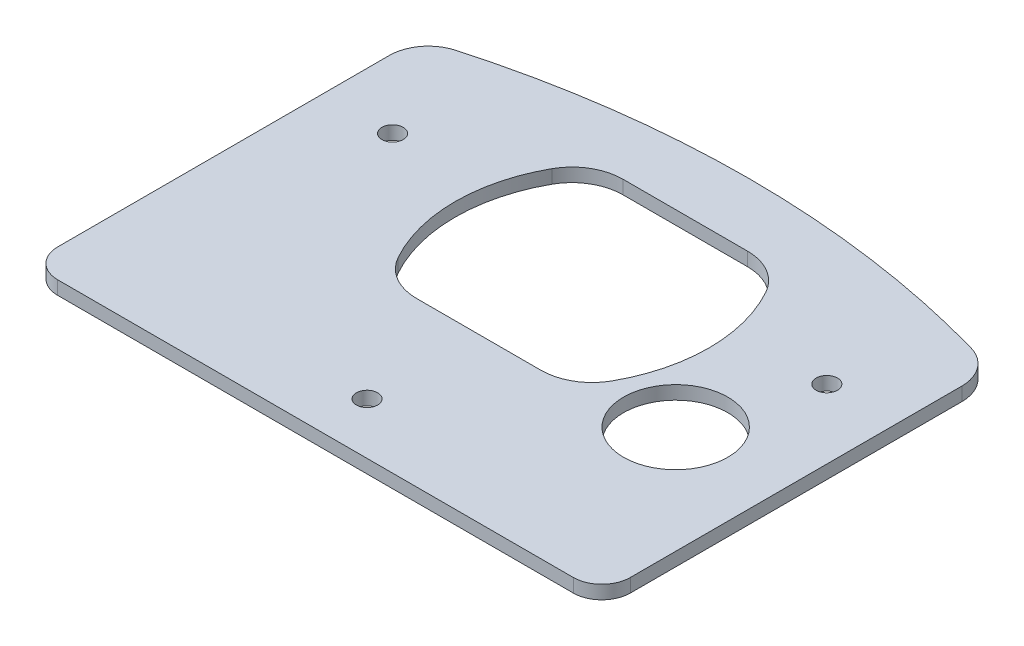
ISO-10303-21;
HEADER;
FILE_DESCRIPTION(('STEP AP214'),'2;1');
FILE_NAME('part.step','',(''),(''),'','','');
FILE_SCHEMA(('AUTOMOTIVE_DESIGN { 1 0 10303 214 1 1 1 1 }'));
ENDSEC;
DATA;
#1=APPLICATION_CONTEXT('core data for automotive mechanical design processes');
#2=APPLICATION_PROTOCOL_DEFINITION('international standard','automotive_design',2000,#1);
#3=PRODUCT_CONTEXT('',#1,'mechanical');
#4=PRODUCT('Part','Part','',(#3));
#5=PRODUCT_RELATED_PRODUCT_CATEGORY('part','',(#4));
#6=PRODUCT_DEFINITION_FORMATION('','',#4);
#7=PRODUCT_DEFINITION_CONTEXT('part definition',#1,'design');
#8=PRODUCT_DEFINITION('design','',#6,#7);
#9=PRODUCT_DEFINITION_SHAPE('','',#8);
#10=(LENGTH_UNIT() NAMED_UNIT(*) SI_UNIT(.MILLI.,.METRE.));
#11=(NAMED_UNIT(*) PLANE_ANGLE_UNIT() SI_UNIT($,.RADIAN.));
#12=(NAMED_UNIT(*) SI_UNIT($,.STERADIAN.) SOLID_ANGLE_UNIT());
#13=UNCERTAINTY_MEASURE_WITH_UNIT(LENGTH_MEASURE(1.E-05),#10,'distance_accuracy_value','');
#14=(GEOMETRIC_REPRESENTATION_CONTEXT(3) GLOBAL_UNCERTAINTY_ASSIGNED_CONTEXT((#13)) GLOBAL_UNIT_ASSIGNED_CONTEXT((#10,
#11,#12)) REPRESENTATION_CONTEXT('',''));
#15=CARTESIAN_POINT('',(0.,0.,0.));
#16=DIRECTION('',(0.,0.,1.));
#17=DIRECTION('',(1.,0.,0.));
#18=AXIS2_PLACEMENT_3D('',#15,#16,#17);
#19=CARTESIAN_POINT('',(0.,3.175,121.));
#20=DIRECTION('',(0.,-1.,0.));
#21=DIRECTION('',(0.,0.,-1.));
#22=AXIS2_PLACEMENT_3D('',#19,#20,#21);
#23=PLANE('',#22);
#24=CARTESIAN_POINT('',(42.,3.175,-42.6));
#25=DIRECTION('',(0.,1.,0.));
#26=DIRECTION('',(0.,0.,1.));
#27=AXIS2_PLACEMENT_3D('',#24,#25,#26);
#28=CIRCLE('',#27,12.25);
#29=CARTESIAN_POINT('',(42.,3.175,-30.35));
#30=VERTEX_POINT('',#29);
#31=EDGE_CURVE('E223',#30,#30,#28,.T.);
#32=ORIENTED_EDGE('',*,*,#31,.F.);
#33=EDGE_LOOP('',(#32));
#34=FACE_BOUND('',#33,.T.);
#35=CARTESIAN_POINT('',(-51.,3.175,-69.1));
#36=DIRECTION('',(0.,1.,0.));
#37=DIRECTION('',(0.,0.,1.));
#38=AXIS2_PLACEMENT_3D('',#35,#36,#37);
#39=CIRCLE('',#38,2.5);
#40=CARTESIAN_POINT('',(-51.,3.175,-66.6));
#41=VERTEX_POINT('',#40);
#42=EDGE_CURVE('E229',#41,#41,#39,.T.);
#43=ORIENTED_EDGE('',*,*,#42,.F.);
#44=EDGE_LOOP('',(#43));
#45=FACE_BOUND('',#44,.T.);
#46=CARTESIAN_POINT('',(0.,3.175,-12.1));
#47=DIRECTION('',(0.,1.,0.));
#48=DIRECTION('',(0.,0.,1.));
#49=AXIS2_PLACEMENT_3D('',#46,#47,#48);
#50=CIRCLE('',#49,2.5);
#51=CARTESIAN_POINT('',(0.,3.175,-9.6));
#52=VERTEX_POINT('',#51);
#53=EDGE_CURVE('E235',#52,#52,#50,.T.);
#54=ORIENTED_EDGE('',*,*,#53,.F.);
#55=EDGE_LOOP('',(#54));
#56=FACE_BOUND('',#55,.T.);
#57=CARTESIAN_POINT('',(51.,3.175,-69.1));
#58=DIRECTION('',(0.,1.,0.));
#59=DIRECTION('',(0.,0.,1.));
#60=AXIS2_PLACEMENT_3D('',#57,#58,#59);
#61=CIRCLE('',#60,2.5);
#62=CARTESIAN_POINT('',(51.,3.175,-66.6));
#63=VERTEX_POINT('',#62);
#64=EDGE_CURVE('E241',#63,#63,#61,.T.);
#65=ORIENTED_EDGE('',*,*,#64,.F.);
#66=EDGE_LOOP('',(#65));
#67=FACE_BOUND('',#66,.T.);
#68=DIRECTION('',(1.,0.,0.));
#69=VECTOR('',#68,1.);
#70=CARTESIAN_POINT('',(-67.25,3.175,0.));
#71=LINE('',#70,#69);
#72=CARTESIAN_POINT('',(-60.55,3.175,0.));
#73=VERTEX_POINT('',#72);
#74=CARTESIAN_POINT('',(60.55,3.175,0.));
#75=VERTEX_POINT('',#74);
#76=EDGE_CURVE('E249',#73,#75,#71,.T.);
#77=ORIENTED_EDGE('',*,*,#76,.T.);
#78=CARTESIAN_POINT('',(60.55,3.175,-6.70000000000002));
#79=DIRECTION('',(0.,-1.,0.));
#80=DIRECTION('',(0.,0.,-1.));
#81=AXIS2_PLACEMENT_3D('',#78,#79,#80);
#82=CIRCLE('',#81,6.7);
#83=CARTESIAN_POINT('',(67.25,3.175,-6.70000000000002));
#84=VERTEX_POINT('',#83);
#85=EDGE_CURVE('E45',#75,#84,#82,.F.);
#86=ORIENTED_EDGE('',*,*,#85,.T.);
#87=DIRECTION('',(0.,0.,-1.));
#88=VECTOR('',#87,1.);
#89=CARTESIAN_POINT('',(67.25,3.175,0.));
#90=LINE('',#89,#88);
#91=CARTESIAN_POINT('',(67.25,3.175,-84.560593256587));
#92=VERTEX_POINT('',#91);
#93=EDGE_CURVE('E252',#84,#92,#90,.T.);
#94=ORIENTED_EDGE('',*,*,#93,.T.);
#95=CARTESIAN_POINT('',(58.05,3.175,-84.560593256587));
#96=DIRECTION('',(0.,-1.,0.));
#97=DIRECTION('',(0.,0.,-1.));
#98=AXIS2_PLACEMENT_3D('',#95,#96,#97);
#99=CIRCLE('',#98,9.2);
#100=CARTESIAN_POINT('',(60.5502808988764,3.175,-93.4143266740055));
#101=VERTEX_POINT('',#100);
#102=EDGE_CURVE('E279',#92,#101,#99,.F.);
#103=ORIENTED_EDGE('',*,*,#102,.T.);
#104=CARTESIAN_POINT('',(0.,3.175,121.));
#105=DIRECTION('',(0.,1.,0.));
#106=DIRECTION('',(0.,0.,-1.));
#107=AXIS2_PLACEMENT_3D('',#104,#105,#106);
#108=CIRCLE('',#107,222.8);
#109=CARTESIAN_POINT('',(-60.5502808988764,3.175,-93.4143266740055));
#110=VERTEX_POINT('',#109);
#111=EDGE_CURVE('E254',#101,#110,#108,.T.);
#112=ORIENTED_EDGE('',*,*,#111,.T.);
#113=CARTESIAN_POINT('',(-58.05,3.175,-84.560593256587));
#114=DIRECTION('',(0.,-1.,0.));
#115=DIRECTION('',(0.,0.,-1.));
#116=AXIS2_PLACEMENT_3D('',#113,#114,#115);
#117=CIRCLE('',#116,9.2);
#118=CARTESIAN_POINT('',(-67.25,3.175,-84.560593256587));
#119=VERTEX_POINT('',#118);
#120=EDGE_CURVE('E277',#110,#119,#117,.F.);
#121=ORIENTED_EDGE('',*,*,#120,.T.);
#122=DIRECTION('',(0.,0.,1.));
#123=VECTOR('',#122,1.);
#124=CARTESIAN_POINT('',(-67.25,3.175,0.));
#125=LINE('',#124,#123);
#126=CARTESIAN_POINT('',(-67.25,3.175,-6.7));
#127=VERTEX_POINT('',#126);
#128=EDGE_CURVE('E247',#119,#127,#125,.T.);
#129=ORIENTED_EDGE('',*,*,#128,.T.);
#130=CARTESIAN_POINT('',(-60.55,3.175,-6.7));
#131=DIRECTION('',(0.,-1.,0.));
#132=DIRECTION('',(0.,0.,-1.));
#133=AXIS2_PLACEMENT_3D('',#130,#131,#132);
#134=CIRCLE('',#133,6.7);
#135=EDGE_CURVE('E295',#127,#73,#134,.F.);
#136=ORIENTED_EDGE('',*,*,#135,.T.);
#137=EDGE_LOOP('',(#77,#86,#94,#103,#112,#121,#129,#136));
#138=FACE_BOUND('',#137,.T.);
#139=CARTESIAN_POINT('',(7.4,3.175,-62.6));
#140=DIRECTION('',(0.,1.,0.));
#141=DIRECTION('',(0.,0.,-1.));
#142=AXIS2_PLACEMENT_3D('',#139,#140,#141);
#143=CIRCLE('',#142,37.2);
#144=CARTESIAN_POINT('',(-25.108968847928,3.175,-80.6833333333333));
#145=VERTEX_POINT('',#144);
#146=CARTESIAN_POINT('',(-25.108968847928,3.175,-44.5166666666667));
#147=VERTEX_POINT('',#146);
#148=EDGE_CURVE('E153',#145,#147,#143,.T.);
#149=ORIENTED_EDGE('',*,*,#148,.F.);
#150=CARTESIAN_POINT('',(-14.6222047034351,3.175,-74.85));
#151=DIRECTION('',(0.,1.,0.));
#152=DIRECTION('',(0.,0.,-1.));
#153=AXIS2_PLACEMENT_3D('',#150,#151,#152);
#154=CIRCLE('',#153,12.);
#155=CARTESIAN_POINT('',(-14.6222047034351,3.175,-86.85));
#156=VERTEX_POINT('',#155);
#157=EDGE_CURVE('E189',#156,#145,#154,.T.);
#158=ORIENTED_EDGE('',*,*,#157,.F.);
#159=DIRECTION('',(-1.,0.,0.));
#160=VECTOR('',#159,1.);
#161=CARTESIAN_POINT('',(-14.6222047034351,3.175,-86.85));
#162=LINE('',#161,#160);
#163=CARTESIAN_POINT('',(14.6222047034351,3.175,-86.85));
#164=VERTEX_POINT('',#163);
#165=EDGE_CURVE('E186',#164,#156,#162,.T.);
#166=ORIENTED_EDGE('',*,*,#165,.F.);
#167=CARTESIAN_POINT('',(14.6222047034351,3.175,-74.85));
#168=DIRECTION('',(0.,1.,0.));
#169=DIRECTION('',(0.,0.,-1.));
#170=AXIS2_PLACEMENT_3D('',#167,#168,#169);
#171=CIRCLE('',#170,12.);
#172=CARTESIAN_POINT('',(25.108968847928,3.175,-80.6833333333333));
#173=VERTEX_POINT('',#172);
#174=EDGE_CURVE('E184',#173,#164,#171,.T.);
#175=ORIENTED_EDGE('',*,*,#174,.F.);
#176=CARTESIAN_POINT('',(-7.4,3.175,-62.6));
#177=DIRECTION('',(0.,1.,0.));
#178=DIRECTION('',(0.,0.,-1.));
#179=AXIS2_PLACEMENT_3D('',#176,#177,#178);
#180=CIRCLE('',#179,37.2);
#181=CARTESIAN_POINT('',(25.108968847928,3.175,-44.5166666666667));
#182=VERTEX_POINT('',#181);
#183=EDGE_CURVE('E182',#182,#173,#180,.T.);
#184=ORIENTED_EDGE('',*,*,#183,.F.);
#185=CARTESIAN_POINT('',(14.6222047034351,3.175,-50.35));
#186=DIRECTION('',(0.,1.,0.));
#187=DIRECTION('',(0.,0.,1.));
#188=AXIS2_PLACEMENT_3D('',#185,#186,#187);
#189=CIRCLE('',#188,12.);
#190=CARTESIAN_POINT('',(14.6222047034351,3.175,-38.35));
#191=VERTEX_POINT('',#190);
#192=EDGE_CURVE('E178',#191,#182,#189,.T.);
#193=ORIENTED_EDGE('',*,*,#192,.F.);
#194=DIRECTION('',(1.,0.,0.));
#195=VECTOR('',#194,1.);
#196=CARTESIAN_POINT('',(-14.6222047034351,3.175,-38.35));
#197=LINE('',#196,#195);
#198=CARTESIAN_POINT('',(-14.6222047034351,3.175,-38.35));
#199=VERTEX_POINT('',#198);
#200=EDGE_CURVE('E176',#199,#191,#197,.T.);
#201=ORIENTED_EDGE('',*,*,#200,.F.);
#202=CARTESIAN_POINT('',(-14.6222047034351,3.175,-50.35));
#203=DIRECTION('',(0.,1.,0.));
#204=DIRECTION('',(0.,0.,-1.));
#205=AXIS2_PLACEMENT_3D('',#202,#203,#204);
#206=CIRCLE('',#205,12.);
#207=EDGE_CURVE('E163',#147,#199,#206,.T.);
#208=ORIENTED_EDGE('',*,*,#207,.F.);
#209=EDGE_LOOP('',(#149,#158,#166,#175,#184,#193,#201,#208));
#210=FACE_BOUND('',#209,.T.);
#211=ADVANCED_FACE('F37',(#34,#45,#56,#67,#138,#210),#23,.F.);
#212=CARTESIAN_POINT('',(0.,0.,121.));
#213=DIRECTION('',(0.,-1.,0.));
#214=DIRECTION('',(0.,0.,-1.));
#215=AXIS2_PLACEMENT_3D('',#212,#213,#214);
#216=PLANE('',#215);
#217=CARTESIAN_POINT('',(-51.,0.,-69.1));
#218=DIRECTION('',(0.,1.,0.));
#219=DIRECTION('',(0.,0.,1.));
#220=AXIS2_PLACEMENT_3D('',#217,#218,#219);
#221=CIRCLE('',#220,2.5);
#222=CARTESIAN_POINT('',(-51.,0.,-66.6));
#223=VERTEX_POINT('',#222);
#224=EDGE_CURVE('E226',#223,#223,#221,.T.);
#225=ORIENTED_EDGE('',*,*,#224,.T.);
#226=EDGE_LOOP('',(#225));
#227=FACE_BOUND('',#226,.T.);
#228=CARTESIAN_POINT('',(51.,0.,-69.1));
#229=DIRECTION('',(0.,1.,0.));
#230=DIRECTION('',(0.,0.,1.));
#231=AXIS2_PLACEMENT_3D('',#228,#229,#230);
#232=CIRCLE('',#231,2.5);
#233=CARTESIAN_POINT('',(51.,0.,-66.6));
#234=VERTEX_POINT('',#233);
#235=EDGE_CURVE('E238',#234,#234,#232,.T.);
#236=ORIENTED_EDGE('',*,*,#235,.T.);
#237=EDGE_LOOP('',(#236));
#238=FACE_BOUND('',#237,.T.);
#239=DIRECTION('',(0.,0.,-1.));
#240=VECTOR('',#239,1.);
#241=CARTESIAN_POINT('',(67.25,0.,0.));
#242=LINE('',#241,#240);
#243=CARTESIAN_POINT('',(67.25,0.,-6.70000000000002));
#244=VERTEX_POINT('',#243);
#245=CARTESIAN_POINT('',(67.25,0.,-84.560593256587));
#246=VERTEX_POINT('',#245);
#247=EDGE_CURVE('E261',#244,#246,#242,.T.);
#248=ORIENTED_EDGE('',*,*,#247,.F.);
#249=CARTESIAN_POINT('',(60.55,0.,-6.70000000000002));
#250=DIRECTION('',(0.,-1.,0.));
#251=DIRECTION('',(0.,0.,-1.));
#252=AXIS2_PLACEMENT_3D('',#249,#250,#251);
#253=CIRCLE('',#252,6.7);
#254=CARTESIAN_POINT('',(60.55,0.,0.));
#255=VERTEX_POINT('',#254);
#256=EDGE_CURVE('E289',#244,#255,#253,.T.);
#257=ORIENTED_EDGE('',*,*,#256,.T.);
#258=DIRECTION('',(1.,0.,0.));
#259=VECTOR('',#258,1.);
#260=CARTESIAN_POINT('',(-67.25,0.,0.));
#261=LINE('',#260,#259);
#262=CARTESIAN_POINT('',(-60.55,0.,0.));
#263=VERTEX_POINT('',#262);
#264=EDGE_CURVE('E259',#263,#255,#261,.T.);
#265=ORIENTED_EDGE('',*,*,#264,.F.);
#266=CARTESIAN_POINT('',(-60.55,0.,-6.7));
#267=DIRECTION('',(0.,-1.,0.));
#268=DIRECTION('',(0.,0.,-1.));
#269=AXIS2_PLACEMENT_3D('',#266,#267,#268);
#270=CIRCLE('',#269,6.7);
#271=CARTESIAN_POINT('',(-67.25,0.,-6.7));
#272=VERTEX_POINT('',#271);
#273=EDGE_CURVE('E287',#263,#272,#270,.T.);
#274=ORIENTED_EDGE('',*,*,#273,.T.);
#275=DIRECTION('',(0.,0.,1.));
#276=VECTOR('',#275,1.);
#277=CARTESIAN_POINT('',(-67.25,0.,0.));
#278=LINE('',#277,#276);
#279=CARTESIAN_POINT('',(-67.25,0.,-84.560593256587));
#280=VERTEX_POINT('',#279);
#281=EDGE_CURVE('E244',#280,#272,#278,.T.);
#282=ORIENTED_EDGE('',*,*,#281,.F.);
#283=CARTESIAN_POINT('',(-58.05,0.,-84.560593256587));
#284=DIRECTION('',(0.,-1.,0.));
#285=DIRECTION('',(0.,0.,-1.));
#286=AXIS2_PLACEMENT_3D('',#283,#284,#285);
#287=CIRCLE('',#286,9.2);
#288=CARTESIAN_POINT('',(-60.5502808988764,0.,-93.4143266740055));
#289=VERTEX_POINT('',#288);
#290=EDGE_CURVE('E269',#280,#289,#287,.T.);
#291=ORIENTED_EDGE('',*,*,#290,.T.);
#292=CARTESIAN_POINT('',(0.,0.,121.));
#293=DIRECTION('',(0.,1.,0.));
#294=DIRECTION('',(0.,0.,-1.));
#295=AXIS2_PLACEMENT_3D('',#292,#293,#294);
#296=CIRCLE('',#295,222.8);
#297=CARTESIAN_POINT('',(60.5502808988764,0.,-93.4143266740055));
#298=VERTEX_POINT('',#297);
#299=EDGE_CURVE('E250',#298,#289,#296,.T.);
#300=ORIENTED_EDGE('',*,*,#299,.F.);
#301=CARTESIAN_POINT('',(58.05,0.,-84.560593256587));
#302=DIRECTION('',(0.,-1.,0.));
#303=DIRECTION('',(0.,0.,-1.));
#304=AXIS2_PLACEMENT_3D('',#301,#302,#303);
#305=CIRCLE('',#304,9.2);
#306=EDGE_CURVE('E271',#298,#246,#305,.T.);
#307=ORIENTED_EDGE('',*,*,#306,.T.);
#308=EDGE_LOOP('',(#248,#257,#265,#274,#282,#291,#300,#307));
#309=FACE_BOUND('',#308,.T.);
#310=CARTESIAN_POINT('',(0.,0.,-12.1));
#311=DIRECTION('',(0.,1.,0.));
#312=DIRECTION('',(0.,0.,1.));
#313=AXIS2_PLACEMENT_3D('',#310,#311,#312);
#314=CIRCLE('',#313,2.5);
#315=CARTESIAN_POINT('',(0.,0.,-9.6));
#316=VERTEX_POINT('',#315);
#317=EDGE_CURVE('E232',#316,#316,#314,.T.);
#318=ORIENTED_EDGE('',*,*,#317,.T.);
#319=EDGE_LOOP('',(#318));
#320=FACE_BOUND('',#319,.T.);
#321=CARTESIAN_POINT('',(42.,0.,-42.6));
#322=DIRECTION('',(0.,1.,0.));
#323=DIRECTION('',(0.,0.,1.));
#324=AXIS2_PLACEMENT_3D('',#321,#322,#323);
#325=CIRCLE('',#324,12.25);
#326=CARTESIAN_POINT('',(42.,0.,-30.35));
#327=VERTEX_POINT('',#326);
#328=EDGE_CURVE('E171',#327,#327,#325,.T.);
#329=ORIENTED_EDGE('',*,*,#328,.T.);
#330=EDGE_LOOP('',(#329));
#331=FACE_BOUND('',#330,.T.);
#332=CARTESIAN_POINT('',(-14.6222047034351,0.,-74.85));
#333=DIRECTION('',(0.,1.,0.));
#334=DIRECTION('',(0.,0.,-1.));
#335=AXIS2_PLACEMENT_3D('',#332,#333,#334);
#336=CIRCLE('',#335,12.);
#337=CARTESIAN_POINT('',(-14.6222047034351,0.,-86.85));
#338=VERTEX_POINT('',#337);
#339=CARTESIAN_POINT('',(-25.108968847928,0.,-80.6833333333333));
#340=VERTEX_POINT('',#339);
#341=EDGE_CURVE('E164',#338,#340,#336,.T.);
#342=ORIENTED_EDGE('',*,*,#341,.T.);
#343=CARTESIAN_POINT('',(7.4,0.,-62.6));
#344=DIRECTION('',(0.,1.,0.));
#345=DIRECTION('',(0.,0.,-1.));
#346=AXIS2_PLACEMENT_3D('',#343,#344,#345);
#347=CIRCLE('',#346,37.2);
#348=CARTESIAN_POINT('',(-25.108968847928,0.,-44.5166666666667));
#349=VERTEX_POINT('',#348);
#350=EDGE_CURVE('E191',#340,#349,#347,.T.);
#351=ORIENTED_EDGE('',*,*,#350,.T.);
#352=CARTESIAN_POINT('',(-14.6222047034351,0.,-50.35));
#353=DIRECTION('',(0.,1.,0.));
#354=DIRECTION('',(0.,0.,-1.));
#355=AXIS2_PLACEMENT_3D('',#352,#353,#354);
#356=CIRCLE('',#355,12.);
#357=CARTESIAN_POINT('',(-14.6222047034351,0.,-38.35));
#358=VERTEX_POINT('',#357);
#359=EDGE_CURVE('E170',#349,#358,#356,.T.);
#360=ORIENTED_EDGE('',*,*,#359,.T.);
#361=DIRECTION('',(1.,0.,0.));
#362=VECTOR('',#361,1.);
#363=CARTESIAN_POINT('',(-14.6222047034351,0.,-38.35));
#364=LINE('',#363,#362);
#365=CARTESIAN_POINT('',(14.6222047034351,0.,-38.35));
#366=VERTEX_POINT('',#365);
#367=EDGE_CURVE('E194',#358,#366,#364,.T.);
#368=ORIENTED_EDGE('',*,*,#367,.T.);
#369=CARTESIAN_POINT('',(14.6222047034351,0.,-50.35));
#370=DIRECTION('',(0.,1.,0.));
#371=DIRECTION('',(0.,0.,1.));
#372=AXIS2_PLACEMENT_3D('',#369,#370,#371);
#373=CIRCLE('',#372,12.);
#374=CARTESIAN_POINT('',(25.108968847928,0.,-44.5166666666667));
#375=VERTEX_POINT('',#374);
#376=EDGE_CURVE('E197',#366,#375,#373,.T.);
#377=ORIENTED_EDGE('',*,*,#376,.T.);
#378=CARTESIAN_POINT('',(-7.4,0.,-62.6));
#379=DIRECTION('',(0.,1.,0.));
#380=DIRECTION('',(0.,0.,-1.));
#381=AXIS2_PLACEMENT_3D('',#378,#379,#380);
#382=CIRCLE('',#381,37.2);
#383=CARTESIAN_POINT('',(25.108968847928,0.,-80.6833333333333));
#384=VERTEX_POINT('',#383);
#385=EDGE_CURVE('E200',#375,#384,#382,.T.);
#386=ORIENTED_EDGE('',*,*,#385,.T.);
#387=CARTESIAN_POINT('',(14.6222047034351,0.,-74.85));
#388=DIRECTION('',(0.,1.,0.));
#389=DIRECTION('',(0.,0.,-1.));
#390=AXIS2_PLACEMENT_3D('',#387,#388,#389);
#391=CIRCLE('',#390,12.);
#392=CARTESIAN_POINT('',(14.6222047034351,0.,-86.85));
#393=VERTEX_POINT('',#392);
#394=EDGE_CURVE('E203',#384,#393,#391,.T.);
#395=ORIENTED_EDGE('',*,*,#394,.T.);
#396=DIRECTION('',(-1.,0.,0.));
#397=VECTOR('',#396,1.);
#398=CARTESIAN_POINT('',(-14.6222047034351,0.,-86.85));
#399=LINE('',#398,#397);
#400=EDGE_CURVE('E206',#393,#338,#399,.T.);
#401=ORIENTED_EDGE('',*,*,#400,.T.);
#402=EDGE_LOOP('',(#342,#351,#360,#368,#377,#386,#395,#401));
#403=FACE_BOUND('',#402,.T.);
#404=ADVANCED_FACE('F309',(#227,#238,#309,#320,#331,#403),#216,.T.);
#405=CARTESIAN_POINT('',(-67.25,3.175,0.));
#406=DIRECTION('',(1.,0.,0.));
#407=DIRECTION('',(0.,0.,-1.));
#408=AXIS2_PLACEMENT_3D('',#405,#406,#407);
#409=PLANE('',#408);
#410=ORIENTED_EDGE('',*,*,#281,.T.);
#411=DIRECTION('',(0.,-1.,0.));
#412=VECTOR('',#411,1.);
#413=CARTESIAN_POINT('',(-67.25,3.175,-6.7));
#414=LINE('',#413,#412);
#415=EDGE_CURVE('E11',#272,#127,#414,.F.);
#416=ORIENTED_EDGE('',*,*,#415,.T.);
#417=ORIENTED_EDGE('',*,*,#128,.F.);
#418=DIRECTION('',(0.,-1.,0.));
#419=VECTOR('',#418,1.);
#420=CARTESIAN_POINT('',(-67.25,3.175,-84.560593256587));
#421=LINE('',#420,#419);
#422=EDGE_CURVE('E281',#119,#280,#421,.T.);
#423=ORIENTED_EDGE('',*,*,#422,.T.);
#424=EDGE_LOOP('',(#410,#416,#417,#423));
#425=FACE_BOUND('',#424,.T.);
#426=ADVANCED_FACE('F316',(#425),#409,.F.);
#427=CARTESIAN_POINT('',(-67.25,3.175,0.));
#428=DIRECTION('',(0.,0.,-1.));
#429=DIRECTION('',(-1.,0.,0.));
#430=AXIS2_PLACEMENT_3D('',#427,#428,#429);
#431=PLANE('',#430);
#432=ORIENTED_EDGE('',*,*,#264,.T.);
#433=DIRECTION('',(0.,-1.,0.));
#434=VECTOR('',#433,1.);
#435=CARTESIAN_POINT('',(60.55,3.175,0.));
#436=LINE('',#435,#434);
#437=EDGE_CURVE('E58',#255,#75,#436,.F.);
#438=ORIENTED_EDGE('',*,*,#437,.T.);
#439=ORIENTED_EDGE('',*,*,#76,.F.);
#440=DIRECTION('',(0.,-1.,0.));
#441=VECTOR('',#440,1.);
#442=CARTESIAN_POINT('',(-60.55,3.175,0.));
#443=LINE('',#442,#441);
#444=EDGE_CURVE('E291',#73,#263,#443,.T.);
#445=ORIENTED_EDGE('',*,*,#444,.T.);
#446=EDGE_LOOP('',(#432,#438,#439,#445));
#447=FACE_BOUND('',#446,.T.);
#448=ADVANCED_FACE('F311',(#447),#431,.F.);
#449=CARTESIAN_POINT('',(67.25,3.175,0.));
#450=DIRECTION('',(-1.,0.,0.));
#451=DIRECTION('',(0.,0.,1.));
#452=AXIS2_PLACEMENT_3D('',#449,#450,#451);
#453=PLANE('',#452);
#454=ORIENTED_EDGE('',*,*,#93,.F.);
#455=DIRECTION('',(0.,-1.,0.));
#456=VECTOR('',#455,1.);
#457=CARTESIAN_POINT('',(67.25,3.175,-6.70000000000002));
#458=LINE('',#457,#456);
#459=EDGE_CURVE('E284',#84,#244,#458,.T.);
#460=ORIENTED_EDGE('',*,*,#459,.T.);
#461=ORIENTED_EDGE('',*,*,#247,.T.);
#462=DIRECTION('',(0.,-1.,0.));
#463=VECTOR('',#462,1.);
#464=CARTESIAN_POINT('',(67.25,3.175,-84.560593256587));
#465=LINE('',#464,#463);
#466=EDGE_CURVE('E274',#246,#92,#465,.F.);
#467=ORIENTED_EDGE('',*,*,#466,.T.);
#468=EDGE_LOOP('',(#454,#460,#461,#467));
#469=FACE_BOUND('',#468,.T.);
#470=ADVANCED_FACE('F302',(#469),#453,.F.);
#471=CARTESIAN_POINT('',(0.,3.175,121.));
#472=DIRECTION('',(0.,-1.,0.));
#473=DIRECTION('',(0.,0.,-1.));
#474=AXIS2_PLACEMENT_3D('',#471,#472,#473);
#475=CYLINDRICAL_SURFACE('',#474,222.8);
#476=ORIENTED_EDGE('',*,*,#111,.F.);
#477=DIRECTION('',(0.,-1.,0.));
#478=VECTOR('',#477,1.);
#479=CARTESIAN_POINT('',(60.5502808988764,3.175,-93.4143266740055));
#480=LINE('',#479,#478);
#481=EDGE_CURVE('E266',#101,#298,#480,.T.);
#482=ORIENTED_EDGE('',*,*,#481,.T.);
#483=ORIENTED_EDGE('',*,*,#299,.T.);
#484=DIRECTION('',(0.,-1.,0.));
#485=VECTOR('',#484,1.);
#486=CARTESIAN_POINT('',(-60.5502808988765,3.175,-93.4143266740055));
#487=LINE('',#486,#485);
#488=EDGE_CURVE('E257',#289,#110,#487,.F.);
#489=ORIENTED_EDGE('',*,*,#488,.T.);
#490=EDGE_LOOP('',(#476,#482,#483,#489));
#491=FACE_BOUND('',#490,.T.);
#492=ADVANCED_FACE('F325',(#491),#475,.T.);
#493=CARTESIAN_POINT('',(51.,3.175,-69.1));
#494=DIRECTION('',(0.,-1.,0.));
#495=DIRECTION('',(0.,0.,-1.));
#496=AXIS2_PLACEMENT_3D('',#493,#494,#495);
#497=CYLINDRICAL_SURFACE('',#496,2.5);
#498=ORIENTED_EDGE('',*,*,#64,.T.);
#499=EDGE_LOOP('',(#498));
#500=FACE_BOUND('',#499,.T.);
#501=ORIENTED_EDGE('',*,*,#235,.F.);
#502=EDGE_LOOP('',(#501));
#503=FACE_BOUND('',#502,.T.);
#504=ADVANCED_FACE('F352',(#500,#503),#497,.F.);
#505=CARTESIAN_POINT('',(0.,3.175,-12.1));
#506=DIRECTION('',(0.,-1.,0.));
#507=DIRECTION('',(0.,0.,-1.));
#508=AXIS2_PLACEMENT_3D('',#505,#506,#507);
#509=CYLINDRICAL_SURFACE('',#508,2.5);
#510=ORIENTED_EDGE('',*,*,#53,.T.);
#511=EDGE_LOOP('',(#510));
#512=FACE_BOUND('',#511,.T.);
#513=ORIENTED_EDGE('',*,*,#317,.F.);
#514=EDGE_LOOP('',(#513));
#515=FACE_BOUND('',#514,.T.);
#516=ADVANCED_FACE('F385',(#512,#515),#509,.F.);
#517=CARTESIAN_POINT('',(-51.,3.175,-69.1));
#518=DIRECTION('',(0.,-1.,0.));
#519=DIRECTION('',(0.,0.,-1.));
#520=AXIS2_PLACEMENT_3D('',#517,#518,#519);
#521=CYLINDRICAL_SURFACE('',#520,2.5);
#522=ORIENTED_EDGE('',*,*,#42,.T.);
#523=EDGE_LOOP('',(#522));
#524=FACE_BOUND('',#523,.T.);
#525=ORIENTED_EDGE('',*,*,#224,.F.);
#526=EDGE_LOOP('',(#525));
#527=FACE_BOUND('',#526,.T.);
#528=ADVANCED_FACE('F392',(#524,#527),#521,.F.);
#529=CARTESIAN_POINT('',(42.,3.175,-42.6));
#530=DIRECTION('',(0.,-1.,0.));
#531=DIRECTION('',(0.,0.,-1.));
#532=AXIS2_PLACEMENT_3D('',#529,#530,#531);
#533=CYLINDRICAL_SURFACE('',#532,12.25);
#534=ORIENTED_EDGE('',*,*,#31,.T.);
#535=EDGE_LOOP('',(#534));
#536=FACE_BOUND('',#535,.T.);
#537=ORIENTED_EDGE('',*,*,#328,.F.);
#538=EDGE_LOOP('',(#537));
#539=FACE_BOUND('',#538,.T.);
#540=ADVANCED_FACE('F399',(#536,#539),#533,.F.);
#541=CARTESIAN_POINT('',(7.4,3.175,-62.6));
#542=DIRECTION('',(0.,-1.,0.));
#543=DIRECTION('',(0.,0.,-1.));
#544=AXIS2_PLACEMENT_3D('',#541,#542,#543);
#545=CYLINDRICAL_SURFACE('',#544,37.2);
#546=ORIENTED_EDGE('',*,*,#350,.F.);
#547=DIRECTION('',(0.,-1.,0.));
#548=VECTOR('',#547,1.);
#549=CARTESIAN_POINT('',(-25.108968847928,3.175,-80.6833333333333));
#550=LINE('',#549,#548);
#551=EDGE_CURVE('E159',#145,#340,#550,.T.);
#552=ORIENTED_EDGE('',*,*,#551,.F.);
#553=ORIENTED_EDGE('',*,*,#148,.T.);
#554=DIRECTION('',(0.,-1.,0.));
#555=VECTOR('',#554,1.);
#556=CARTESIAN_POINT('',(-25.108968847928,3.175,-44.5166666666667));
#557=LINE('',#556,#555);
#558=EDGE_CURVE('E156',#147,#349,#557,.T.);
#559=ORIENTED_EDGE('',*,*,#558,.T.);
#560=EDGE_LOOP('',(#546,#552,#553,#559));
#561=FACE_BOUND('',#560,.T.);
#562=ADVANCED_FACE('F155',(#561),#545,.F.);
#563=CARTESIAN_POINT('',(-14.6222047034351,3.175,-50.35));
#564=DIRECTION('',(0.,-1.,0.));
#565=DIRECTION('',(0.,0.,-1.));
#566=AXIS2_PLACEMENT_3D('',#563,#564,#565);
#567=CYLINDRICAL_SURFACE('',#566,12.);
#568=ORIENTED_EDGE('',*,*,#359,.F.);
#569=ORIENTED_EDGE('',*,*,#558,.F.);
#570=ORIENTED_EDGE('',*,*,#207,.T.);
#571=DIRECTION('',(0.,-1.,0.));
#572=VECTOR('',#571,1.);
#573=CARTESIAN_POINT('',(-14.6222047034351,3.175,-38.35));
#574=LINE('',#573,#572);
#575=EDGE_CURVE('E172',#199,#358,#574,.T.);
#576=ORIENTED_EDGE('',*,*,#575,.T.);
#577=EDGE_LOOP('',(#568,#569,#570,#576));
#578=FACE_BOUND('',#577,.T.);
#579=ADVANCED_FACE('F167',(#578),#567,.F.);
#580=CARTESIAN_POINT('',(-14.6222047034351,3.175,-38.35));
#581=DIRECTION('',(0.,0.,-1.));
#582=DIRECTION('',(-1.,0.,0.));
#583=AXIS2_PLACEMENT_3D('',#580,#581,#582);
#584=PLANE('',#583);
#585=ORIENTED_EDGE('',*,*,#367,.F.);
#586=ORIENTED_EDGE('',*,*,#575,.F.);
#587=ORIENTED_EDGE('',*,*,#200,.T.);
#588=DIRECTION('',(0.,-1.,0.));
#589=VECTOR('',#588,1.);
#590=CARTESIAN_POINT('',(14.6222047034351,3.175,-38.35));
#591=LINE('',#590,#589);
#592=EDGE_CURVE('E220',#191,#366,#591,.T.);
#593=ORIENTED_EDGE('',*,*,#592,.T.);
#594=EDGE_LOOP('',(#585,#586,#587,#593));
#595=FACE_BOUND('',#594,.T.);
#596=ADVANCED_FACE('F420',(#595),#584,.T.);
#597=CARTESIAN_POINT('',(14.6222047034351,3.175,-50.35));
#598=DIRECTION('',(0.,-1.,0.));
#599=DIRECTION('',(0.,0.,-1.));
#600=AXIS2_PLACEMENT_3D('',#597,#598,#599);
#601=CYLINDRICAL_SURFACE('',#600,12.);
#602=ORIENTED_EDGE('',*,*,#376,.F.);
#603=ORIENTED_EDGE('',*,*,#592,.F.);
#604=ORIENTED_EDGE('',*,*,#192,.T.);
#605=DIRECTION('',(0.,-1.,0.));
#606=VECTOR('',#605,1.);
#607=CARTESIAN_POINT('',(25.108968847928,3.175,-44.5166666666667));
#608=LINE('',#607,#606);
#609=EDGE_CURVE('E218',#182,#375,#608,.T.);
#610=ORIENTED_EDGE('',*,*,#609,.T.);
#611=EDGE_LOOP('',(#602,#603,#604,#610));
#612=FACE_BOUND('',#611,.T.);
#613=ADVANCED_FACE('F427',(#612),#601,.F.);
#614=CARTESIAN_POINT('',(-7.4,3.175,-62.6));
#615=DIRECTION('',(0.,-1.,0.));
#616=DIRECTION('',(0.,0.,-1.));
#617=AXIS2_PLACEMENT_3D('',#614,#615,#616);
#618=CYLINDRICAL_SURFACE('',#617,37.2);
#619=ORIENTED_EDGE('',*,*,#385,.F.);
#620=ORIENTED_EDGE('',*,*,#609,.F.);
#621=ORIENTED_EDGE('',*,*,#183,.T.);
#622=DIRECTION('',(0.,-1.,0.));
#623=VECTOR('',#622,1.);
#624=CARTESIAN_POINT('',(25.108968847928,3.175,-80.6833333333333));
#625=LINE('',#624,#623);
#626=EDGE_CURVE('E216',#173,#384,#625,.T.);
#627=ORIENTED_EDGE('',*,*,#626,.T.);
#628=EDGE_LOOP('',(#619,#620,#621,#627));
#629=FACE_BOUND('',#628,.T.);
#630=ADVANCED_FACE('F435',(#629),#618,.F.);
#631=CARTESIAN_POINT('',(14.6222047034351,3.175,-74.85));
#632=DIRECTION('',(0.,-1.,0.));
#633=DIRECTION('',(0.,0.,-1.));
#634=AXIS2_PLACEMENT_3D('',#631,#632,#633);
#635=CYLINDRICAL_SURFACE('',#634,12.);
#636=ORIENTED_EDGE('',*,*,#394,.F.);
#637=ORIENTED_EDGE('',*,*,#626,.F.);
#638=ORIENTED_EDGE('',*,*,#174,.T.);
#639=DIRECTION('',(0.,-1.,0.));
#640=VECTOR('',#639,1.);
#641=CARTESIAN_POINT('',(14.6222047034351,3.175,-86.85));
#642=LINE('',#641,#640);
#643=EDGE_CURVE('E214',#164,#393,#642,.T.);
#644=ORIENTED_EDGE('',*,*,#643,.T.);
#645=EDGE_LOOP('',(#636,#637,#638,#644));
#646=FACE_BOUND('',#645,.T.);
#647=ADVANCED_FACE('F443',(#646),#635,.F.);
#648=CARTESIAN_POINT('',(-14.6222047034351,3.175,-86.85));
#649=DIRECTION('',(0.,0.,1.));
#650=DIRECTION('',(1.,0.,0.));
#651=AXIS2_PLACEMENT_3D('',#648,#649,#650);
#652=PLANE('',#651);
#653=ORIENTED_EDGE('',*,*,#400,.F.);
#654=ORIENTED_EDGE('',*,*,#643,.F.);
#655=ORIENTED_EDGE('',*,*,#165,.T.);
#656=DIRECTION('',(0.,-1.,0.));
#657=VECTOR('',#656,1.);
#658=CARTESIAN_POINT('',(-14.6222047034351,3.175,-86.85));
#659=LINE('',#658,#657);
#660=EDGE_CURVE('E212',#156,#338,#659,.T.);
#661=ORIENTED_EDGE('',*,*,#660,.T.);
#662=EDGE_LOOP('',(#653,#654,#655,#661));
#663=FACE_BOUND('',#662,.T.);
#664=ADVANCED_FACE('F337',(#663),#652,.T.);
#665=CARTESIAN_POINT('',(-14.6222047034351,3.175,-74.85));
#666=DIRECTION('',(0.,-1.,0.));
#667=DIRECTION('',(0.,0.,-1.));
#668=AXIS2_PLACEMENT_3D('',#665,#666,#667);
#669=CYLINDRICAL_SURFACE('',#668,12.);
#670=ORIENTED_EDGE('',*,*,#341,.F.);
#671=ORIENTED_EDGE('',*,*,#660,.F.);
#672=ORIENTED_EDGE('',*,*,#157,.T.);
#673=ORIENTED_EDGE('',*,*,#551,.T.);
#674=EDGE_LOOP('',(#670,#671,#672,#673));
#675=FACE_BOUND('',#674,.T.);
#676=ADVANCED_FACE('F330',(#675),#669,.F.);
#677=CARTESIAN_POINT('',(58.05,3.175,-84.560593256587));
#678=DIRECTION('',(0.,-1.,0.));
#679=DIRECTION('',(0.,0.,-1.));
#680=AXIS2_PLACEMENT_3D('',#677,#678,#679);
#681=CYLINDRICAL_SURFACE('',#680,9.2);
#682=ORIENTED_EDGE('',*,*,#102,.F.);
#683=ORIENTED_EDGE('',*,*,#466,.F.);
#684=ORIENTED_EDGE('',*,*,#306,.F.);
#685=ORIENTED_EDGE('',*,*,#481,.F.);
#686=EDGE_LOOP('',(#682,#683,#684,#685));
#687=FACE_BOUND('',#686,.T.);
#688=ADVANCED_FACE('F328',(#687),#681,.T.);
#689=CARTESIAN_POINT('',(-58.05,3.175,-84.560593256587));
#690=DIRECTION('',(0.,-1.,0.));
#691=DIRECTION('',(0.,0.,-1.));
#692=AXIS2_PLACEMENT_3D('',#689,#690,#691);
#693=CYLINDRICAL_SURFACE('',#692,9.2);
#694=ORIENTED_EDGE('',*,*,#120,.F.);
#695=ORIENTED_EDGE('',*,*,#488,.F.);
#696=ORIENTED_EDGE('',*,*,#290,.F.);
#697=ORIENTED_EDGE('',*,*,#422,.F.);
#698=EDGE_LOOP('',(#694,#695,#696,#697));
#699=FACE_BOUND('',#698,.T.);
#700=ADVANCED_FACE('F320',(#699),#693,.T.);
#701=CARTESIAN_POINT('',(60.55,3.175,-6.70000000000002));
#702=DIRECTION('',(0.,-1.,0.));
#703=DIRECTION('',(0.,0.,-1.));
#704=AXIS2_PLACEMENT_3D('',#701,#702,#703);
#705=CYLINDRICAL_SURFACE('',#704,6.7);
#706=ORIENTED_EDGE('',*,*,#85,.F.);
#707=ORIENTED_EDGE('',*,*,#437,.F.);
#708=ORIENTED_EDGE('',*,*,#256,.F.);
#709=ORIENTED_EDGE('',*,*,#459,.F.);
#710=EDGE_LOOP('',(#706,#707,#708,#709));
#711=FACE_BOUND('',#710,.T.);
#712=ADVANCED_FACE('F306',(#711),#705,.T.);
#713=CARTESIAN_POINT('',(-60.55,3.175,-6.7));
#714=DIRECTION('',(0.,-1.,0.));
#715=DIRECTION('',(0.,0.,-1.));
#716=AXIS2_PLACEMENT_3D('',#713,#714,#715);
#717=CYLINDRICAL_SURFACE('',#716,6.7);
#718=ORIENTED_EDGE('',*,*,#135,.F.);
#719=ORIENTED_EDGE('',*,*,#415,.F.);
#720=ORIENTED_EDGE('',*,*,#273,.F.);
#721=ORIENTED_EDGE('',*,*,#444,.F.);
#722=EDGE_LOOP('',(#718,#719,#720,#721));
#723=FACE_BOUND('',#722,.T.);
#724=ADVANCED_FACE('F39',(#723),#717,.T.);
#725=CLOSED_SHELL('',(#211,#404,#426,#448,#470,#492,#504,#516,#528,#540,#562,#579,#596,#613,
#630,#647,#664,#676,#688,#700,#712,#724));
#726=MANIFOLD_SOLID_BREP('B2',#725);
#727=ADVANCED_BREP_SHAPE_REPRESENTATION('',(#18,#726),#14);
#728=SHAPE_DEFINITION_REPRESENTATION(#9,#727);
ENDSEC;
END-ISO-10303-21;
